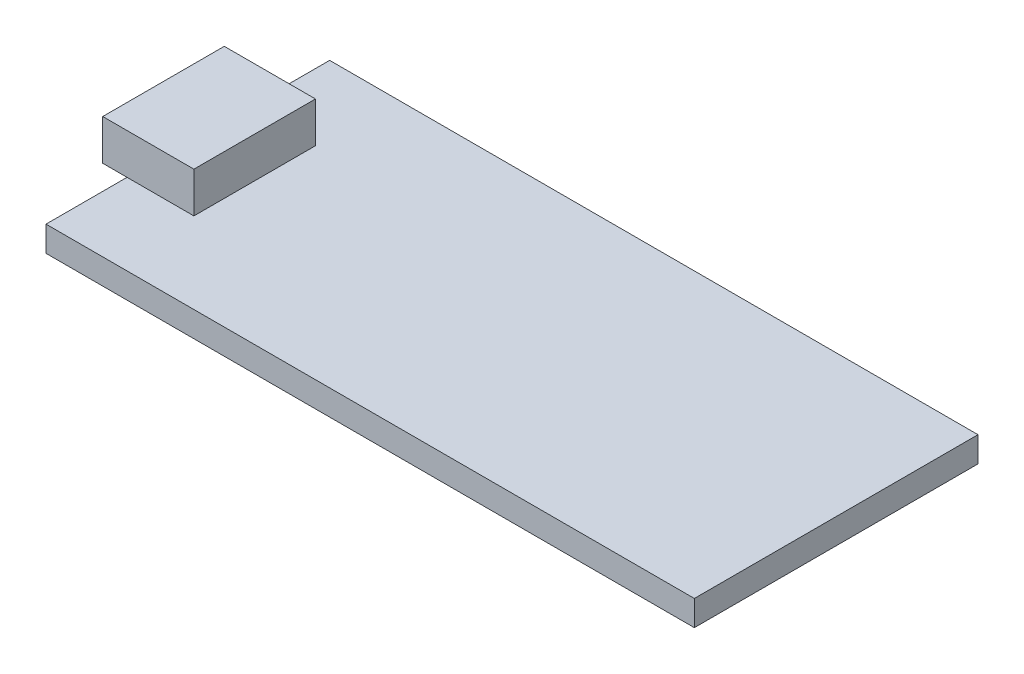
ISO-10303-21;
HEADER;
FILE_DESCRIPTION(('STEP AP214'),'2;1');
FILE_NAME('part.step','',(''),(''),'','','');
FILE_SCHEMA(('AUTOMOTIVE_DESIGN { 1 0 10303 214 1 1 1 1 }'));
ENDSEC;
DATA;
#1=APPLICATION_CONTEXT('core data for automotive mechanical design processes');
#2=APPLICATION_PROTOCOL_DEFINITION('international standard','automotive_design',2000,#1);
#3=PRODUCT_CONTEXT('',#1,'mechanical');
#4=PRODUCT('Part','Part','',(#3));
#5=PRODUCT_RELATED_PRODUCT_CATEGORY('part','',(#4));
#6=PRODUCT_DEFINITION_FORMATION('','',#4);
#7=PRODUCT_DEFINITION_CONTEXT('part definition',#1,'design');
#8=PRODUCT_DEFINITION('design','',#6,#7);
#9=PRODUCT_DEFINITION_SHAPE('','',#8);
#10=(LENGTH_UNIT() NAMED_UNIT(*) SI_UNIT(.MILLI.,.METRE.));
#11=(NAMED_UNIT(*) PLANE_ANGLE_UNIT() SI_UNIT($,.RADIAN.));
#12=(NAMED_UNIT(*) SI_UNIT($,.STERADIAN.) SOLID_ANGLE_UNIT());
#13=UNCERTAINTY_MEASURE_WITH_UNIT(LENGTH_MEASURE(1.E-05),#10,'distance_accuracy_value','');
#14=(GEOMETRIC_REPRESENTATION_CONTEXT(3) GLOBAL_UNCERTAINTY_ASSIGNED_CONTEXT((#13)) GLOBAL_UNIT_ASSIGNED_CONTEXT((#10,
#11,#12)) REPRESENTATION_CONTEXT('',''));
#15=CARTESIAN_POINT('',(0.,0.,0.));
#16=DIRECTION('',(0.,0.,1.));
#17=DIRECTION('',(1.,0.,0.));
#18=AXIS2_PLACEMENT_3D('',#15,#16,#17);
#19=CARTESIAN_POINT('',(0.,1.5875,0.));
#20=DIRECTION('',(0.,-1.,0.));
#21=DIRECTION('',(0.,0.,-1.));
#22=AXIS2_PLACEMENT_3D('',#19,#20,#21);
#23=PLANE('',#22);
#24=DIRECTION('',(-1.,0.,0.));
#25=VECTOR('',#24,1.);
#26=CARTESIAN_POINT('',(-1.524,1.5875,-12.7));
#27=LINE('',#26,#25);
#28=CARTESIAN_POINT('',(4.191,1.5875,-12.7));
#29=VERTEX_POINT('',#28);
#30=CARTESIAN_POINT('',(0.,1.5875,-12.7));
#31=VERTEX_POINT('',#30);
#32=EDGE_CURVE('E57',#29,#31,#27,.T.);
#33=ORIENTED_EDGE('',*,*,#32,.F.);
#34=DIRECTION('',(0.,0.,-1.));
#35=VECTOR('',#34,1.);
#36=CARTESIAN_POINT('',(4.191,1.5875,-12.7));
#37=LINE('',#36,#35);
#38=CARTESIAN_POINT('',(4.191,1.5875,-5.08));
#39=VERTEX_POINT('',#38);
#40=EDGE_CURVE('E212',#39,#29,#37,.T.);
#41=ORIENTED_EDGE('',*,*,#40,.F.);
#42=DIRECTION('',(1.,0.,0.));
#43=VECTOR('',#42,1.);
#44=CARTESIAN_POINT('',(-1.524,1.5875,-5.08));
#45=LINE('',#44,#43);
#46=CARTESIAN_POINT('',(0.,1.5875,-5.08));
#47=VERTEX_POINT('',#46);
#48=EDGE_CURVE('E11',#47,#39,#45,.T.);
#49=ORIENTED_EDGE('',*,*,#48,.F.);
#50=DIRECTION('',(0.,0.,1.));
#51=VECTOR('',#50,1.);
#52=CARTESIAN_POINT('',(0.,1.5875,0.));
#53=LINE('',#52,#51);
#54=CARTESIAN_POINT('',(0.,1.5875,0.));
#55=VERTEX_POINT('',#54);
#56=EDGE_CURVE('E155',#47,#55,#53,.T.);
#57=ORIENTED_EDGE('',*,*,#56,.T.);
#58=DIRECTION('',(1.,0.,0.));
#59=VECTOR('',#58,1.);
#60=CARTESIAN_POINT('',(0.,1.5875,0.));
#61=LINE('',#60,#59);
#62=CARTESIAN_POINT('',(40.64,1.5875,0.));
#63=VERTEX_POINT('',#62);
#64=EDGE_CURVE('E153',#55,#63,#61,.T.);
#65=ORIENTED_EDGE('',*,*,#64,.T.);
#66=DIRECTION('',(0.,0.,-1.));
#67=VECTOR('',#66,1.);
#68=CARTESIAN_POINT('',(40.64,1.5875,0.));
#69=LINE('',#68,#67);
#70=CARTESIAN_POINT('',(40.64,1.5875,-17.78));
#71=VERTEX_POINT('',#70);
#72=EDGE_CURVE('E158',#63,#71,#69,.T.);
#73=ORIENTED_EDGE('',*,*,#72,.T.);
#74=DIRECTION('',(-1.,0.,0.));
#75=VECTOR('',#74,1.);
#76=CARTESIAN_POINT('',(0.,1.5875,-17.78));
#77=LINE('',#76,#75);
#78=CARTESIAN_POINT('',(0.,1.5875,-17.78));
#79=VERTEX_POINT('',#78);
#80=EDGE_CURVE('E161',#71,#79,#77,.T.);
#81=ORIENTED_EDGE('',*,*,#80,.T.);
#82=EDGE_CURVE('E150',#79,#31,#53,.T.);
#83=ORIENTED_EDGE('',*,*,#82,.T.);
#84=EDGE_LOOP('',(#33,#41,#49,#57,#65,#73,#81,#83));
#85=FACE_BOUND('',#84,.T.);
#86=ADVANCED_FACE('F39',(#85),#23,.F.);
#87=CARTESIAN_POINT('',(0.,1.5875,0.));
#88=DIRECTION('',(1.,0.,0.));
#89=DIRECTION('',(0.,0.,-1.));
#90=AXIS2_PLACEMENT_3D('',#87,#88,#89);
#91=PLANE('',#90);
#92=DIRECTION('',(0.,0.,1.));
#93=VECTOR('',#92,1.);
#94=CARTESIAN_POINT('',(0.,0.,0.));
#95=LINE('',#94,#93);
#96=CARTESIAN_POINT('',(0.,0.,-17.78));
#97=VERTEX_POINT('',#96);
#98=CARTESIAN_POINT('',(0.,0.,0.));
#99=VERTEX_POINT('',#98);
#100=EDGE_CURVE('E139',#97,#99,#95,.T.);
#101=ORIENTED_EDGE('',*,*,#100,.T.);
#102=DIRECTION('',(0.,-1.,0.));
#103=VECTOR('',#102,1.);
#104=CARTESIAN_POINT('',(0.,1.5875,0.));
#105=LINE('',#104,#103);
#106=EDGE_CURVE('E43',#55,#99,#105,.T.);
#107=ORIENTED_EDGE('',*,*,#106,.F.);
#108=ORIENTED_EDGE('',*,*,#56,.F.);
#109=EDGE_CURVE('E154',#31,#47,#53,.T.);
#110=ORIENTED_EDGE('',*,*,#109,.F.);
#111=ORIENTED_EDGE('',*,*,#82,.F.);
#112=DIRECTION('',(0.,-1.,0.));
#113=VECTOR('',#112,1.);
#114=CARTESIAN_POINT('',(0.,1.5875,-17.78));
#115=LINE('',#114,#113);
#116=EDGE_CURVE('E163',#79,#97,#115,.T.);
#117=ORIENTED_EDGE('',*,*,#116,.T.);
#118=EDGE_LOOP('',(#101,#107,#108,#110,#111,#117));
#119=FACE_BOUND('',#118,.T.);
#120=ADVANCED_FACE('F41',(#119),#91,.F.);
#121=CARTESIAN_POINT('',(0.,1.5875,0.));
#122=DIRECTION('',(0.,0.,-1.));
#123=DIRECTION('',(-1.,0.,0.));
#124=AXIS2_PLACEMENT_3D('',#121,#122,#123);
#125=PLANE('',#124);
#126=DIRECTION('',(1.,0.,0.));
#127=VECTOR('',#126,1.);
#128=CARTESIAN_POINT('',(0.,0.,0.));
#129=LINE('',#128,#127);
#130=CARTESIAN_POINT('',(40.64,0.,0.));
#131=VERTEX_POINT('',#130);
#132=EDGE_CURVE('E144',#99,#131,#129,.T.);
#133=ORIENTED_EDGE('',*,*,#132,.T.);
#134=DIRECTION('',(0.,-1.,0.));
#135=VECTOR('',#134,1.);
#136=CARTESIAN_POINT('',(40.64,1.5875,0.));
#137=LINE('',#136,#135);
#138=EDGE_CURVE('E179',#63,#131,#137,.T.);
#139=ORIENTED_EDGE('',*,*,#138,.F.);
#140=ORIENTED_EDGE('',*,*,#64,.F.);
#141=ORIENTED_EDGE('',*,*,#106,.T.);
#142=EDGE_LOOP('',(#133,#139,#140,#141));
#143=FACE_BOUND('',#142,.T.);
#144=ADVANCED_FACE('F191',(#143),#125,.F.);
#145=CARTESIAN_POINT('',(40.64,1.5875,0.));
#146=DIRECTION('',(-1.,0.,0.));
#147=DIRECTION('',(0.,0.,1.));
#148=AXIS2_PLACEMENT_3D('',#145,#146,#147);
#149=PLANE('',#148);
#150=DIRECTION('',(0.,0.,-1.));
#151=VECTOR('',#150,1.);
#152=CARTESIAN_POINT('',(40.64,0.,0.));
#153=LINE('',#152,#151);
#154=CARTESIAN_POINT('',(40.64,0.,-17.78));
#155=VERTEX_POINT('',#154);
#156=EDGE_CURVE('E167',#131,#155,#153,.T.);
#157=ORIENTED_EDGE('',*,*,#156,.T.);
#158=DIRECTION('',(0.,-1.,0.));
#159=VECTOR('',#158,1.);
#160=CARTESIAN_POINT('',(40.64,1.5875,-17.78));
#161=LINE('',#160,#159);
#162=EDGE_CURVE('E176',#71,#155,#161,.T.);
#163=ORIENTED_EDGE('',*,*,#162,.F.);
#164=ORIENTED_EDGE('',*,*,#72,.F.);
#165=ORIENTED_EDGE('',*,*,#138,.T.);
#166=EDGE_LOOP('',(#157,#163,#164,#165));
#167=FACE_BOUND('',#166,.T.);
#168=ADVANCED_FACE('F200',(#167),#149,.F.);
#169=CARTESIAN_POINT('',(0.,1.5875,-17.78));
#170=DIRECTION('',(0.,0.,1.));
#171=DIRECTION('',(1.,0.,0.));
#172=AXIS2_PLACEMENT_3D('',#169,#170,#171);
#173=PLANE('',#172);
#174=DIRECTION('',(-1.,0.,0.));
#175=VECTOR('',#174,1.);
#176=CARTESIAN_POINT('',(0.,0.,-17.78));
#177=LINE('',#176,#175);
#178=EDGE_CURVE('E170',#155,#97,#177,.T.);
#179=ORIENTED_EDGE('',*,*,#178,.T.);
#180=ORIENTED_EDGE('',*,*,#116,.F.);
#181=ORIENTED_EDGE('',*,*,#80,.F.);
#182=ORIENTED_EDGE('',*,*,#162,.T.);
#183=EDGE_LOOP('',(#179,#180,#181,#182));
#184=FACE_BOUND('',#183,.T.);
#185=ADVANCED_FACE('F203',(#184),#173,.F.);
#186=CARTESIAN_POINT('',(0.,0.,0.));
#187=DIRECTION('',(0.,-1.,0.));
#188=DIRECTION('',(0.,0.,-1.));
#189=AXIS2_PLACEMENT_3D('',#186,#187,#188);
#190=PLANE('',#189);
#191=ORIENTED_EDGE('',*,*,#100,.F.);
#192=ORIENTED_EDGE('',*,*,#178,.F.);
#193=ORIENTED_EDGE('',*,*,#156,.F.);
#194=ORIENTED_EDGE('',*,*,#132,.F.);
#195=EDGE_LOOP('',(#191,#192,#193,#194));
#196=FACE_BOUND('',#195,.T.);
#197=ADVANCED_FACE('F198',(#196),#190,.T.);
#198=CARTESIAN_POINT('',(0.,1.5875,0.));
#199=DIRECTION('',(0.,1.,0.));
#200=DIRECTION('',(0.,0.,1.));
#201=AXIS2_PLACEMENT_3D('',#198,#199,#200);
#202=PLANE('',#201);
#203=CARTESIAN_POINT('',(-1.524,1.5875,-12.7));
#204=VERTEX_POINT('',#203);
#205=EDGE_CURVE('E210',#31,#204,#27,.T.);
#206=ORIENTED_EDGE('',*,*,#205,.F.);
#207=ORIENTED_EDGE('',*,*,#109,.T.);
#208=CARTESIAN_POINT('',(-1.524,1.5875,-5.08));
#209=VERTEX_POINT('',#208);
#210=EDGE_CURVE('E50',#209,#47,#45,.T.);
#211=ORIENTED_EDGE('',*,*,#210,.F.);
#212=DIRECTION('',(0.,0.,1.));
#213=VECTOR('',#212,1.);
#214=CARTESIAN_POINT('',(-1.524,1.5875,-12.7));
#215=LINE('',#214,#213);
#216=EDGE_CURVE('E137',#204,#209,#215,.T.);
#217=ORIENTED_EDGE('',*,*,#216,.F.);
#218=EDGE_LOOP('',(#206,#207,#211,#217));
#219=FACE_BOUND('',#218,.T.);
#220=ADVANCED_FACE('F209',(#219),#202,.F.);
#221=CARTESIAN_POINT('',(-1.524,4.1275,-12.7));
#222=DIRECTION('',(1.,0.,0.));
#223=DIRECTION('',(0.,0.,-1.));
#224=AXIS2_PLACEMENT_3D('',#221,#222,#223);
#225=PLANE('',#224);
#226=ORIENTED_EDGE('',*,*,#216,.T.);
#227=DIRECTION('',(0.,-1.,0.));
#228=VECTOR('',#227,1.);
#229=CARTESIAN_POINT('',(-1.524,4.1275,-5.08));
#230=LINE('',#229,#228);
#231=CARTESIAN_POINT('',(-1.524,4.1275,-5.08));
#232=VERTEX_POINT('',#231);
#233=EDGE_CURVE('E116',#232,#209,#230,.T.);
#234=ORIENTED_EDGE('',*,*,#233,.F.);
#235=DIRECTION('',(0.,0.,1.));
#236=VECTOR('',#235,1.);
#237=CARTESIAN_POINT('',(-1.524,4.1275,-12.7));
#238=LINE('',#237,#236);
#239=CARTESIAN_POINT('',(-1.524,4.1275,-12.7));
#240=VERTEX_POINT('',#239);
#241=EDGE_CURVE('E124',#240,#232,#238,.T.);
#242=ORIENTED_EDGE('',*,*,#241,.F.);
#243=DIRECTION('',(0.,-1.,0.));
#244=VECTOR('',#243,1.);
#245=CARTESIAN_POINT('',(-1.524,4.1275,-12.7));
#246=LINE('',#245,#244);
#247=EDGE_CURVE('E221',#240,#204,#246,.T.);
#248=ORIENTED_EDGE('',*,*,#247,.T.);
#249=EDGE_LOOP('',(#226,#234,#242,#248));
#250=FACE_BOUND('',#249,.T.);
#251=ADVANCED_FACE('F135',(#250),#225,.F.);
#252=CARTESIAN_POINT('',(-1.524,4.1275,-5.08));
#253=DIRECTION('',(0.,0.,-1.));
#254=DIRECTION('',(-1.,0.,0.));
#255=AXIS2_PLACEMENT_3D('',#252,#253,#254);
#256=PLANE('',#255);
#257=ORIENTED_EDGE('',*,*,#210,.T.);
#258=ORIENTED_EDGE('',*,*,#48,.T.);
#259=DIRECTION('',(0.,-1.,0.));
#260=VECTOR('',#259,1.);
#261=CARTESIAN_POINT('',(4.191,4.1275,-5.08));
#262=LINE('',#261,#260);
#263=CARTESIAN_POINT('',(4.191,4.1275,-5.08));
#264=VERTEX_POINT('',#263);
#265=EDGE_CURVE('E119',#264,#39,#262,.T.);
#266=ORIENTED_EDGE('',*,*,#265,.F.);
#267=DIRECTION('',(1.,0.,0.));
#268=VECTOR('',#267,1.);
#269=CARTESIAN_POINT('',(-1.524,4.1275,-5.08));
#270=LINE('',#269,#268);
#271=EDGE_CURVE('E111',#232,#264,#270,.T.);
#272=ORIENTED_EDGE('',*,*,#271,.F.);
#273=ORIENTED_EDGE('',*,*,#233,.T.);
#274=EDGE_LOOP('',(#257,#258,#266,#272,#273));
#275=FACE_BOUND('',#274,.T.);
#276=ADVANCED_FACE('F114',(#275),#256,.F.);
#277=CARTESIAN_POINT('',(4.191,4.1275,-12.7));
#278=DIRECTION('',(-1.,0.,0.));
#279=DIRECTION('',(0.,0.,1.));
#280=AXIS2_PLACEMENT_3D('',#277,#278,#279);
#281=PLANE('',#280);
#282=ORIENTED_EDGE('',*,*,#40,.T.);
#283=DIRECTION('',(0.,-1.,0.));
#284=VECTOR('',#283,1.);
#285=CARTESIAN_POINT('',(4.191,4.1275,-12.7));
#286=LINE('',#285,#284);
#287=CARTESIAN_POINT('',(4.191,4.1275,-12.7));
#288=VERTEX_POINT('',#287);
#289=EDGE_CURVE('E146',#288,#29,#286,.T.);
#290=ORIENTED_EDGE('',*,*,#289,.F.);
#291=DIRECTION('',(0.,0.,-1.));
#292=VECTOR('',#291,1.);
#293=CARTESIAN_POINT('',(4.191,4.1275,-12.7));
#294=LINE('',#293,#292);
#295=EDGE_CURVE('E123',#264,#288,#294,.T.);
#296=ORIENTED_EDGE('',*,*,#295,.F.);
#297=ORIENTED_EDGE('',*,*,#265,.T.);
#298=EDGE_LOOP('',(#282,#290,#296,#297));
#299=FACE_BOUND('',#298,.T.);
#300=ADVANCED_FACE('F229',(#299),#281,.F.);
#301=CARTESIAN_POINT('',(-1.524,4.1275,-12.7));
#302=DIRECTION('',(0.,0.,1.));
#303=DIRECTION('',(1.,0.,0.));
#304=AXIS2_PLACEMENT_3D('',#301,#302,#303);
#305=PLANE('',#304);
#306=ORIENTED_EDGE('',*,*,#32,.T.);
#307=ORIENTED_EDGE('',*,*,#205,.T.);
#308=ORIENTED_EDGE('',*,*,#247,.F.);
#309=DIRECTION('',(-1.,0.,0.));
#310=VECTOR('',#309,1.);
#311=CARTESIAN_POINT('',(-1.524,4.1275,-12.7));
#312=LINE('',#311,#310);
#313=EDGE_CURVE('E129',#288,#240,#312,.T.);
#314=ORIENTED_EDGE('',*,*,#313,.F.);
#315=ORIENTED_EDGE('',*,*,#289,.T.);
#316=EDGE_LOOP('',(#306,#307,#308,#314,#315));
#317=FACE_BOUND('',#316,.T.);
#318=ADVANCED_FACE('F227',(#317),#305,.F.);
#319=CARTESIAN_POINT('',(0.,4.1275,0.));
#320=DIRECTION('',(0.,1.,0.));
#321=DIRECTION('',(0.,0.,1.));
#322=AXIS2_PLACEMENT_3D('',#319,#320,#321);
#323=PLANE('',#322);
#324=ORIENTED_EDGE('',*,*,#241,.T.);
#325=ORIENTED_EDGE('',*,*,#271,.T.);
#326=ORIENTED_EDGE('',*,*,#295,.T.);
#327=ORIENTED_EDGE('',*,*,#313,.T.);
#328=EDGE_LOOP('',(#324,#325,#326,#327));
#329=FACE_BOUND('',#328,.T.);
#330=ADVANCED_FACE('F127',(#329),#323,.T.);
#331=CLOSED_SHELL('',(#86,#120,#144,#168,#185,#197,#220,#251,#276,#300,#318,#330));
#332=MANIFOLD_SOLID_BREP('B2',#331);
#333=ADVANCED_BREP_SHAPE_REPRESENTATION('',(#18,#332),#14);
#334=SHAPE_DEFINITION_REPRESENTATION(#9,#333);
ENDSEC;
END-ISO-10303-21;
